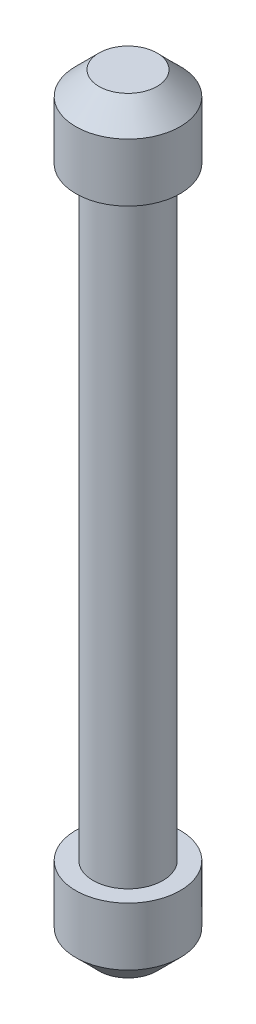
ISO-10303-21;
HEADER;
FILE_DESCRIPTION(('STEP AP214'),'2;1');
FILE_NAME('part.step','',(''),(''),'','','');
FILE_SCHEMA(('AUTOMOTIVE_DESIGN { 1 0 10303 214 1 1 1 1 }'));
ENDSEC;
DATA;
#1=APPLICATION_CONTEXT('core data for automotive mechanical design processes');
#2=APPLICATION_PROTOCOL_DEFINITION('international standard','automotive_design',2000,#1);
#3=PRODUCT_CONTEXT('',#1,'mechanical');
#4=PRODUCT('Part','Part','',(#3));
#5=PRODUCT_RELATED_PRODUCT_CATEGORY('part','',(#4));
#6=PRODUCT_DEFINITION_FORMATION('','',#4);
#7=PRODUCT_DEFINITION_CONTEXT('part definition',#1,'design');
#8=PRODUCT_DEFINITION('design','',#6,#7);
#9=PRODUCT_DEFINITION_SHAPE('','',#8);
#10=(LENGTH_UNIT() NAMED_UNIT(*) SI_UNIT(.MILLI.,.METRE.));
#11=(NAMED_UNIT(*) PLANE_ANGLE_UNIT() SI_UNIT($,.RADIAN.));
#12=(NAMED_UNIT(*) SI_UNIT($,.STERADIAN.) SOLID_ANGLE_UNIT());
#13=UNCERTAINTY_MEASURE_WITH_UNIT(LENGTH_MEASURE(1.E-05),#10,'distance_accuracy_value','');
#14=(GEOMETRIC_REPRESENTATION_CONTEXT(3) GLOBAL_UNCERTAINTY_ASSIGNED_CONTEXT((#13)) GLOBAL_UNIT_ASSIGNED_CONTEXT((#10,
#11,#12)) REPRESENTATION_CONTEXT('',''));
#15=CARTESIAN_POINT('',(0.,0.,0.));
#16=DIRECTION('',(0.,0.,1.));
#17=DIRECTION('',(1.,0.,0.));
#18=AXIS2_PLACEMENT_3D('',#15,#16,#17);
#19=CARTESIAN_POINT('',(0.,0.,0.));
#20=DIRECTION('',(0.,1.,0.));
#21=DIRECTION('',(0.,0.,1.));
#22=AXIS2_PLACEMENT_3D('',#19,#20,#21);
#23=PLANE('',#22);
#24=CARTESIAN_POINT('',(0.,0.,0.));
#25=DIRECTION('',(0.,1.,0.));
#26=DIRECTION('',(0.,0.,1.));
#27=AXIS2_PLACEMENT_3D('',#24,#25,#26);
#28=CIRCLE('',#27,2.25);
#29=CARTESIAN_POINT('',(0.,0.,2.25));
#30=VERTEX_POINT('',#29);
#31=EDGE_CURVE('E53',#30,#30,#28,.T.);
#32=ORIENTED_EDGE('',*,*,#31,.F.);
#33=EDGE_LOOP('',(#32));
#34=FACE_BOUND('',#33,.T.);
#35=CARTESIAN_POINT('',(0.,0.,0.));
#36=DIRECTION('',(0.,1.,0.));
#37=DIRECTION('',(0.,0.,1.));
#38=AXIS2_PLACEMENT_3D('',#35,#36,#37);
#39=CIRCLE('',#38,1.5);
#40=CARTESIAN_POINT('',(0.,0.,1.5));
#41=VERTEX_POINT('',#40);
#42=EDGE_CURVE('E50',#41,#41,#39,.F.);
#43=ORIENTED_EDGE('',*,*,#42,.F.);
#44=EDGE_LOOP('',(#43));
#45=FACE_BOUND('',#44,.T.);
#46=ADVANCED_FACE('F30',(#34,#45),#23,.F.);
#47=CARTESIAN_POINT('',(0.,3.5,0.));
#48=DIRECTION('',(0.,-1.,0.));
#49=DIRECTION('',(0.,0.,-1.));
#50=AXIS2_PLACEMENT_3D('',#47,#48,#49);
#51=CYLINDRICAL_SURFACE('',#50,2.25);
#52=CARTESIAN_POINT('',(0.,2.49999999999999,0.));
#53=DIRECTION('',(0.,1.,0.));
#54=DIRECTION('',(0.,0.,1.));
#55=AXIS2_PLACEMENT_3D('',#52,#53,#54);
#56=CIRCLE('',#55,2.25);
#57=CARTESIAN_POINT('',(0.,2.49999999999999,2.25));
#58=VERTEX_POINT('',#57);
#59=EDGE_CURVE('E10',#58,#58,#56,.F.);
#60=ORIENTED_EDGE('',*,*,#59,.T.);
#61=EDGE_LOOP('',(#60));
#62=FACE_BOUND('',#61,.T.);
#63=ORIENTED_EDGE('',*,*,#31,.T.);
#64=EDGE_LOOP('',(#63));
#65=FACE_BOUND('',#64,.T.);
#66=ADVANCED_FACE('F79',(#62,#65),#51,.T.);
#67=CARTESIAN_POINT('',(0.,3.5,0.));
#68=DIRECTION('',(0.,1.,0.));
#69=DIRECTION('',(0.,0.,1.));
#70=AXIS2_PLACEMENT_3D('',#67,#68,#69);
#71=PLANE('',#70);
#72=CARTESIAN_POINT('',(0.,3.5,0.));
#73=DIRECTION('',(0.,1.,0.));
#74=DIRECTION('',(0.,0.,1.));
#75=AXIS2_PLACEMENT_3D('',#72,#73,#74);
#76=CIRCLE('',#75,1.24999999999999);
#77=CARTESIAN_POINT('',(0.,3.5,1.24999999999999));
#78=VERTEX_POINT('',#77);
#79=EDGE_CURVE('E37',#78,#78,#76,.T.);
#80=ORIENTED_EDGE('',*,*,#79,.T.);
#81=EDGE_LOOP('',(#80));
#82=FACE_BOUND('',#81,.T.);
#83=ADVANCED_FACE('F74',(#82),#71,.T.);
#84=CARTESIAN_POINT('',(0.,-26.,0.));
#85=DIRECTION('',(0.,1.,0.));
#86=DIRECTION('',(0.,0.,1.));
#87=AXIS2_PLACEMENT_3D('',#84,#85,#86);
#88=CYLINDRICAL_SURFACE('',#87,1.5);
#89=CARTESIAN_POINT('',(0.,-26.,0.));
#90=DIRECTION('',(0.,-1.,0.));
#91=DIRECTION('',(0.,0.,-1.));
#92=AXIS2_PLACEMENT_3D('',#89,#90,#91);
#93=CIRCLE('',#92,1.5);
#94=CARTESIAN_POINT('',(0.,-26.,1.5));
#95=VERTEX_POINT('',#94);
#96=EDGE_CURVE('E56',#95,#95,#93,.T.);
#97=CARTESIAN_POINT('',(0.,-26.,1.5));
#98=CARTESIAN_POINT('',(0.,-25.7291666666667,1.5));
#99=CARTESIAN_POINT('',(0.,-25.4583333333333,1.5));
#100=CARTESIAN_POINT('',(0.,-24.9166666666667,1.5));
#101=CARTESIAN_POINT('',(0.,-24.6458333333333,1.5));
#102=CARTESIAN_POINT('',(0.,-24.1041666666667,1.5));
#103=CARTESIAN_POINT('',(0.,-23.8333333333333,1.5));
#104=CARTESIAN_POINT('',(0.,-23.2916666666667,1.5));
#105=CARTESIAN_POINT('',(0.,-23.0208333333333,1.5));
#106=CARTESIAN_POINT('',(0.,-22.4791666666667,1.5));
#107=CARTESIAN_POINT('',(0.,-22.2083333333333,1.5));
#108=CARTESIAN_POINT('',(0.,-21.6666666666667,1.5));
#109=CARTESIAN_POINT('',(0.,-21.3958333333333,1.5));
#110=CARTESIAN_POINT('',(0.,-20.8541666666667,1.5));
#111=CARTESIAN_POINT('',(0.,-20.5833333333333,1.5));
#112=CARTESIAN_POINT('',(0.,-20.0416666666667,1.5));
#113=CARTESIAN_POINT('',(0.,-19.7708333333333,1.5));
#114=CARTESIAN_POINT('',(0.,-19.2291666666667,1.5));
#115=CARTESIAN_POINT('',(0.,-18.9583333333333,1.5));
#116=CARTESIAN_POINT('',(0.,-18.4166666666667,1.5));
#117=CARTESIAN_POINT('',(0.,-18.1458333333333,1.5));
#118=CARTESIAN_POINT('',(0.,-17.6041666666667,1.5));
#119=CARTESIAN_POINT('',(0.,-17.3333333333333,1.5));
#120=CARTESIAN_POINT('',(0.,-16.7916666666667,1.5));
#121=CARTESIAN_POINT('',(0.,-16.5208333333333,1.5));
#122=CARTESIAN_POINT('',(0.,-15.9791666666667,1.5));
#123=CARTESIAN_POINT('',(0.,-15.7083333333333,1.5));
#124=CARTESIAN_POINT('',(0.,-15.1666666666667,1.5));
#125=CARTESIAN_POINT('',(0.,-14.8958333333333,1.5));
#126=CARTESIAN_POINT('',(0.,-14.3541666666667,1.5));
#127=CARTESIAN_POINT('',(0.,-14.0833333333333,1.5));
#128=CARTESIAN_POINT('',(0.,-13.5416666666667,1.5));
#129=CARTESIAN_POINT('',(0.,-13.2708333333333,1.5));
#130=CARTESIAN_POINT('',(0.,-12.7291666666667,1.5));
#131=CARTESIAN_POINT('',(0.,-12.4583333333333,1.5));
#132=CARTESIAN_POINT('',(0.,-11.9166666666667,1.5));
#133=CARTESIAN_POINT('',(0.,-11.6458333333333,1.5));
#134=CARTESIAN_POINT('',(0.,-11.1041666666667,1.5));
#135=CARTESIAN_POINT('',(0.,-10.8333333333333,1.5));
#136=CARTESIAN_POINT('',(0.,-10.2916666666667,1.5));
#137=CARTESIAN_POINT('',(0.,-10.0208333333333,1.5));
#138=CARTESIAN_POINT('',(0.,-9.47916666666667,1.5));
#139=CARTESIAN_POINT('',(0.,-9.20833333333333,1.5));
#140=CARTESIAN_POINT('',(0.,-8.66666666666667,1.5));
#141=CARTESIAN_POINT('',(0.,-8.39583333333333,1.5));
#142=CARTESIAN_POINT('',(0.,-7.85416666666667,1.5));
#143=CARTESIAN_POINT('',(0.,-7.58333333333333,1.5));
#144=CARTESIAN_POINT('',(0.,-7.04166666666667,1.5));
#145=CARTESIAN_POINT('',(0.,-6.77083333333333,1.5));
#146=CARTESIAN_POINT('',(0.,-6.22916666666667,1.5));
#147=CARTESIAN_POINT('',(0.,-5.95833333333333,1.5));
#148=CARTESIAN_POINT('',(0.,-5.41666666666667,1.5));
#149=CARTESIAN_POINT('',(0.,-5.14583333333333,1.5));
#150=CARTESIAN_POINT('',(0.,-4.60416666666667,1.5));
#151=CARTESIAN_POINT('',(0.,-4.33333333333333,1.5));
#152=CARTESIAN_POINT('',(0.,-3.79166666666667,1.5));
#153=CARTESIAN_POINT('',(0.,-3.52083333333333,1.5));
#154=CARTESIAN_POINT('',(0.,-2.97916666666667,1.5));
#155=CARTESIAN_POINT('',(0.,-2.70833333333333,1.5));
#156=CARTESIAN_POINT('',(0.,-2.16666666666667,1.5));
#157=CARTESIAN_POINT('',(0.,-1.89583333333333,1.5));
#158=CARTESIAN_POINT('',(0.,-1.35416666666667,1.5));
#159=CARTESIAN_POINT('',(0.,-1.08333333333333,1.5));
#160=CARTESIAN_POINT('',(0.,-0.541666666666667,1.5));
#161=CARTESIAN_POINT('',(0.,-0.270833333333334,1.5));
#162=CARTESIAN_POINT('',(0.,0.,1.5));
#163=B_SPLINE_CURVE_WITH_KNOTS('',3,(#97,#98,#99,#100,#101,#102,#103,#104,#105,#106,#107,#108,
#109,#110,#111,#112,#113,#114,#115,#116,#117,#118,#119,#120,#121,#122,#123,#124,#125,#126,#127,
#128,#129,#130,#131,#132,#133,#134,#135,#136,#137,#138,#139,#140,#141,#142,#143,#144,#145,#146,
#147,#148,#149,#150,#151,#152,#153,#154,#155,#156,#157,#158,#159,#160,#161,#162),.UNSPECIFIED.,
.F.,.F.,(4,2,2,2,2,2,2,2,2,2,2,2,2,2,2,2,2,2,2,2,2,2,2,2,2,2,2,2,2,2,2,2,4),(0.,
0.812500000000001,1.625,2.4375,3.25,4.0625,4.875,5.6875,6.5,7.3125,8.125,8.9375,9.75,10.5625,
11.375,12.1875,13.,13.8125,14.625,15.4375,16.25,17.0625,17.875,18.6875,19.5,20.3125,21.125,
21.9375,22.75,23.5625,24.375,25.1875,26.),.UNSPECIFIED.);
#164=EDGE_CURVE('BSEAM68',#95,#41,#163,.T.);
#165=ORIENTED_EDGE('',*,*,#96,.F.);
#166=ORIENTED_EDGE('',*,*,#42,.T.);
#167=ORIENTED_EDGE('',*,*,#164,.T.);
#168=ORIENTED_EDGE('',*,*,#164,.F.);
#169=EDGE_LOOP('',(#165,#167,#166,#168));
#170=FACE_BOUND('',#169,.T.);
#171=ADVANCED_FACE('F68',(#170),#88,.T.);
#172=CARTESIAN_POINT('',(0.,-26.,0.));
#173=DIRECTION('',(0.,-1.,0.));
#174=DIRECTION('',(0.,0.,-1.));
#175=AXIS2_PLACEMENT_3D('',#172,#173,#174);
#176=PLANE('',#175);
#177=CARTESIAN_POINT('',(0.,-26.,0.));
#178=DIRECTION('',(0.,-1.,0.));
#179=DIRECTION('',(0.,0.,-1.));
#180=AXIS2_PLACEMENT_3D('',#177,#178,#179);
#181=CIRCLE('',#180,2.25);
#182=CARTESIAN_POINT('',(0.,-26.,-2.25));
#183=VERTEX_POINT('',#182);
#184=EDGE_CURVE('E59',#183,#183,#181,.T.);
#185=ORIENTED_EDGE('',*,*,#184,.F.);
#186=EDGE_LOOP('',(#185));
#187=FACE_BOUND('',#186,.T.);
#188=ORIENTED_EDGE('',*,*,#96,.T.);
#189=EDGE_LOOP('',(#188));
#190=FACE_BOUND('',#189,.T.);
#191=ADVANCED_FACE('F65',(#187,#190),#176,.F.);
#192=CARTESIAN_POINT('',(0.,-29.5,0.));
#193=DIRECTION('',(0.,1.,0.));
#194=DIRECTION('',(0.,0.,1.));
#195=AXIS2_PLACEMENT_3D('',#192,#193,#194);
#196=CYLINDRICAL_SURFACE('',#195,2.25);
#197=CARTESIAN_POINT('',(0.,-28.5,0.));
#198=DIRECTION('',(0.,-1.,0.));
#199=DIRECTION('',(0.,0.,-1.));
#200=AXIS2_PLACEMENT_3D('',#197,#198,#199);
#201=CIRCLE('',#200,2.25);
#202=CARTESIAN_POINT('',(0.,-28.5,-2.25));
#203=VERTEX_POINT('',#202);
#204=EDGE_CURVE('E41',#203,#203,#201,.F.);
#205=ORIENTED_EDGE('',*,*,#204,.T.);
#206=EDGE_LOOP('',(#205));
#207=FACE_BOUND('',#206,.T.);
#208=ORIENTED_EDGE('',*,*,#184,.T.);
#209=EDGE_LOOP('',(#208));
#210=FACE_BOUND('',#209,.T.);
#211=ADVANCED_FACE('F63',(#207,#210),#196,.T.);
#212=CARTESIAN_POINT('',(0.,-29.5,0.));
#213=DIRECTION('',(0.,-1.,0.));
#214=DIRECTION('',(0.,0.,-1.));
#215=AXIS2_PLACEMENT_3D('',#212,#213,#214);
#216=PLANE('',#215);
#217=CARTESIAN_POINT('',(0.,-29.5,0.));
#218=DIRECTION('',(0.,-1.,0.));
#219=DIRECTION('',(0.,0.,-1.));
#220=AXIS2_PLACEMENT_3D('',#217,#218,#219);
#221=CIRCLE('',#220,1.24999999999999);
#222=CARTESIAN_POINT('',(0.,-29.5,-1.24999999999999));
#223=VERTEX_POINT('',#222);
#224=EDGE_CURVE('E45',#223,#223,#221,.T.);
#225=ORIENTED_EDGE('',*,*,#224,.T.);
#226=EDGE_LOOP('',(#225));
#227=FACE_BOUND('',#226,.T.);
#228=ADVANCED_FACE('F90',(#227),#216,.T.);
#229=CARTESIAN_POINT('',(0.,-29.5,0.));
#230=DIRECTION('',(0.,1.,0.));
#231=DIRECTION('',(0.,0.,1.));
#232=AXIS2_PLACEMENT_3D('',#229,#230,#231);
#233=CONICAL_SURFACE('',#232,1.24999999999999,0.785398163397447);
#234=ORIENTED_EDGE('',*,*,#204,.F.);
#235=EDGE_LOOP('',(#234));
#236=FACE_BOUND('',#235,.T.);
#237=ORIENTED_EDGE('',*,*,#224,.F.);
#238=EDGE_LOOP('',(#237));
#239=FACE_BOUND('',#238,.T.);
#240=ADVANCED_FACE('F88',(#236,#239),#233,.T.);
#241=CARTESIAN_POINT('',(0.,3.5,0.));
#242=DIRECTION('',(0.,-1.,0.));
#243=DIRECTION('',(0.,0.,-1.));
#244=AXIS2_PLACEMENT_3D('',#241,#242,#243);
#245=CONICAL_SURFACE('',#244,1.24999999999999,0.785398163397448);
#246=ORIENTED_EDGE('',*,*,#59,.F.);
#247=EDGE_LOOP('',(#246));
#248=FACE_BOUND('',#247,.T.);
#249=ORIENTED_EDGE('',*,*,#79,.F.);
#250=EDGE_LOOP('',(#249));
#251=FACE_BOUND('',#250,.T.);
#252=ADVANCED_FACE('F32',(#248,#251),#245,.T.);
#253=CLOSED_SHELL('',(#46,#66,#83,#171,#191,#211,#228,#240,#252));
#254=MANIFOLD_SOLID_BREP('B2',#253);
#255=ADVANCED_BREP_SHAPE_REPRESENTATION('',(#18,#254),#14);
#256=SHAPE_DEFINITION_REPRESENTATION(#9,#255);
ENDSEC;
END-ISO-10303-21;
